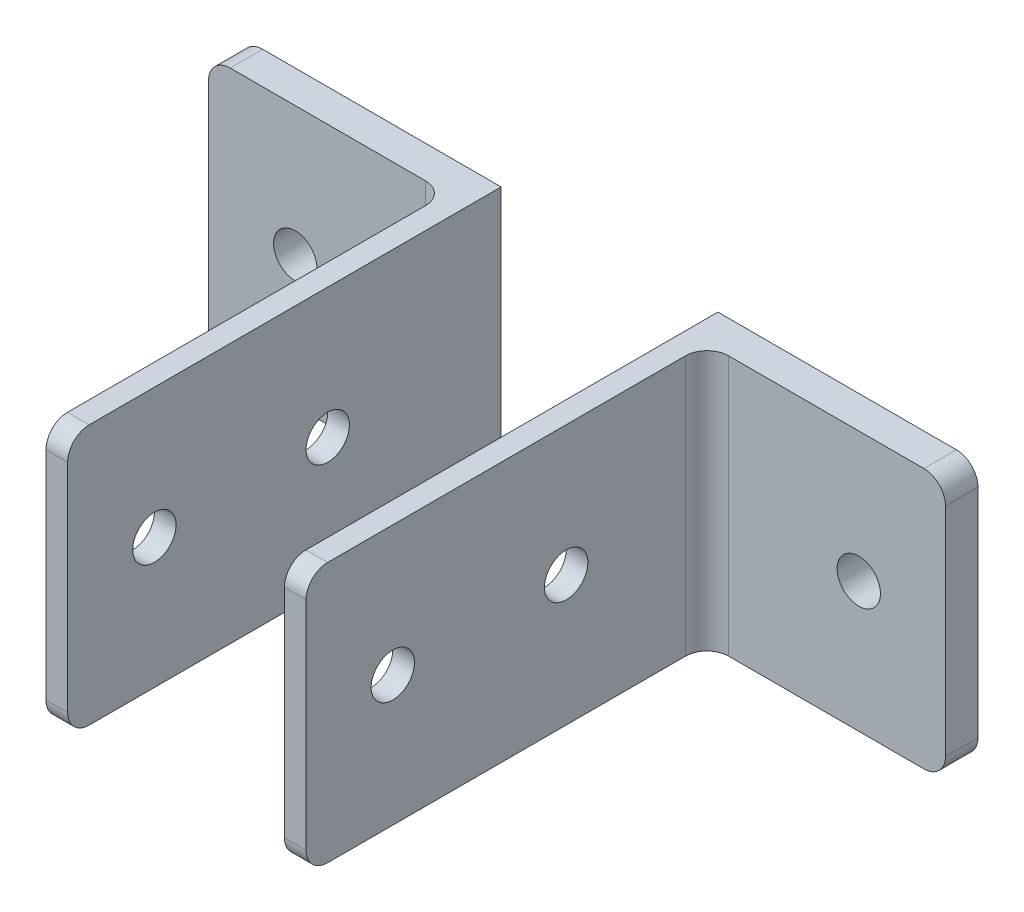
ISO-10303-21;
HEADER;
FILE_DESCRIPTION(('STEP AP214'),'2;1');
FILE_NAME('part.step','',(''),(''),'','','');
FILE_SCHEMA(('AUTOMOTIVE_DESIGN { 1 0 10303 214 1 1 1 1 }'));
ENDSEC;
DATA;
#1=APPLICATION_CONTEXT('core data for automotive mechanical design processes');
#2=APPLICATION_PROTOCOL_DEFINITION('international standard','automotive_design',2000,#1);
#3=PRODUCT_CONTEXT('',#1,'mechanical');
#4=PRODUCT('Part','Part','',(#3));
#5=PRODUCT_RELATED_PRODUCT_CATEGORY('part','',(#4));
#6=PRODUCT_DEFINITION_FORMATION('','',#4);
#7=PRODUCT_DEFINITION_CONTEXT('part definition',#1,'design');
#8=PRODUCT_DEFINITION('design','',#6,#7);
#9=PRODUCT_DEFINITION_SHAPE('','',#8);
#10=(LENGTH_UNIT() NAMED_UNIT(*) SI_UNIT(.MILLI.,.METRE.));
#11=(NAMED_UNIT(*) PLANE_ANGLE_UNIT() SI_UNIT($,.RADIAN.));
#12=(NAMED_UNIT(*) SI_UNIT($,.STERADIAN.) SOLID_ANGLE_UNIT());
#13=UNCERTAINTY_MEASURE_WITH_UNIT(LENGTH_MEASURE(1.E-05),#10,'distance_accuracy_value','');
#14=(GEOMETRIC_REPRESENTATION_CONTEXT(3) GLOBAL_UNCERTAINTY_ASSIGNED_CONTEXT((#13)) GLOBAL_UNIT_ASSIGNED_CONTEXT((#10,
#11,#12)) REPRESENTATION_CONTEXT('',''));
#15=CARTESIAN_POINT('',(0.,0.,0.));
#16=DIRECTION('',(0.,0.,1.));
#17=DIRECTION('',(1.,0.,0.));
#18=AXIS2_PLACEMENT_3D('',#15,#16,#17);
#19=CARTESIAN_POINT('',(15.875,19.05,63.5));
#20=DIRECTION('',(1.,0.,0.));
#21=DIRECTION('',(0.,0.,-1.));
#22=AXIS2_PLACEMENT_3D('',#19,#20,#21);
#23=PLANE('',#22);
#24=CARTESIAN_POINT('',(15.875,0.,25.4));
#25=DIRECTION('',(1.,0.,0.));
#26=DIRECTION('',(0.,0.,-1.));
#27=AXIS2_PLACEMENT_3D('',#24,#25,#26);
#28=CIRCLE('',#27,3.175);
#29=CARTESIAN_POINT('',(15.875,0.,22.225));
#30=VERTEX_POINT('',#29);
#31=EDGE_CURVE('E169',#30,#30,#28,.F.);
#32=ORIENTED_EDGE('',*,*,#31,.F.);
#33=EDGE_LOOP('',(#32));
#34=FACE_BOUND('',#33,.T.);
#35=DIRECTION('',(0.,0.,1.));
#36=VECTOR('',#35,1.);
#37=CARTESIAN_POINT('',(15.875,-19.05,63.5));
#38=LINE('',#37,#36);
#39=CARTESIAN_POINT('',(15.875,-19.05,0.));
#40=VERTEX_POINT('',#39);
#41=CARTESIAN_POINT('',(15.875,-19.05,60.3377));
#42=VERTEX_POINT('',#41);
#43=EDGE_CURVE('E221',#40,#42,#38,.T.);
#44=ORIENTED_EDGE('',*,*,#43,.T.);
#45=CARTESIAN_POINT('',(15.875,-15.8877,60.3377));
#46=DIRECTION('',(1.,0.,0.));
#47=DIRECTION('',(0.,0.,-1.));
#48=AXIS2_PLACEMENT_3D('',#45,#46,#47);
#49=CIRCLE('',#48,3.1623);
#50=CARTESIAN_POINT('',(15.875,-15.8877,63.5));
#51=VERTEX_POINT('',#50);
#52=EDGE_CURVE('E187',#42,#51,#49,.F.);
#53=ORIENTED_EDGE('',*,*,#52,.T.);
#54=DIRECTION('',(0.,-1.,0.));
#55=VECTOR('',#54,1.);
#56=CARTESIAN_POINT('',(15.875,19.05,63.5));
#57=LINE('',#56,#55);
#58=CARTESIAN_POINT('',(15.875,15.8877,63.5));
#59=VERTEX_POINT('',#58);
#60=EDGE_CURVE('E153',#59,#51,#57,.T.);
#61=ORIENTED_EDGE('',*,*,#60,.F.);
#62=CARTESIAN_POINT('',(15.875,15.8877,60.3377));
#63=DIRECTION('',(1.,0.,0.));
#64=DIRECTION('',(0.,0.,-1.));
#65=AXIS2_PLACEMENT_3D('',#62,#63,#64);
#66=CIRCLE('',#65,3.1623);
#67=CARTESIAN_POINT('',(15.875,19.05,60.3377));
#68=VERTEX_POINT('',#67);
#69=EDGE_CURVE('E144',#59,#68,#66,.F.);
#70=ORIENTED_EDGE('',*,*,#69,.T.);
#71=DIRECTION('',(0.,0.,1.));
#72=VECTOR('',#71,1.);
#73=CARTESIAN_POINT('',(15.875,19.05,63.5));
#74=LINE('',#73,#72);
#75=CARTESIAN_POINT('',(15.875,19.05,0.));
#76=VERTEX_POINT('',#75);
#77=EDGE_CURVE('E129',#76,#68,#74,.T.);
#78=ORIENTED_EDGE('',*,*,#77,.F.);
#79=DIRECTION('',(0.,-1.,0.));
#80=VECTOR('',#79,1.);
#81=CARTESIAN_POINT('',(15.875,19.05,0.));
#82=LINE('',#81,#80);
#83=EDGE_CURVE('E141',#76,#40,#82,.T.);
#84=ORIENTED_EDGE('',*,*,#83,.T.);
#85=EDGE_LOOP('',(#44,#53,#61,#70,#78,#84));
#86=FACE_BOUND('',#85,.T.);
#87=CARTESIAN_POINT('',(15.875,0.,50.8));
#88=DIRECTION('',(1.,0.,0.));
#89=DIRECTION('',(0.,0.,-1.));
#90=AXIS2_PLACEMENT_3D('',#87,#88,#89);
#91=CIRCLE('',#90,3.175);
#92=CARTESIAN_POINT('',(15.875,0.,47.625));
#93=VERTEX_POINT('',#92);
#94=EDGE_CURVE('E172',#93,#93,#91,.F.);
#95=ORIENTED_EDGE('',*,*,#94,.F.);
#96=EDGE_LOOP('',(#95));
#97=FACE_BOUND('',#96,.T.);
#98=ADVANCED_FACE('F41',(#34,#86,#97),#23,.F.);
#99=CARTESIAN_POINT('',(19.05,19.05,4.7625));
#100=DIRECTION('',(-1.,0.,0.));
#101=DIRECTION('',(0.,0.,1.));
#102=AXIS2_PLACEMENT_3D('',#99,#100,#101);
#103=PLANE('',#102);
#104=CARTESIAN_POINT('',(19.05,0.,25.4));
#105=DIRECTION('',(-1.,0.,0.));
#106=DIRECTION('',(0.,0.,1.));
#107=AXIS2_PLACEMENT_3D('',#104,#105,#106);
#108=CIRCLE('',#107,3.175);
#109=CARTESIAN_POINT('',(19.05,0.,28.575));
#110=VERTEX_POINT('',#109);
#111=EDGE_CURVE('E166',#110,#110,#108,.F.);
#112=ORIENTED_EDGE('',*,*,#111,.F.);
#113=EDGE_LOOP('',(#112));
#114=FACE_BOUND('',#113,.T.);
#115=DIRECTION('',(0.,-1.,0.));
#116=VECTOR('',#115,1.);
#117=CARTESIAN_POINT('',(19.05,19.05,63.5));
#118=LINE('',#117,#116);
#119=CARTESIAN_POINT('',(19.05,15.8877,63.5));
#120=VERTEX_POINT('',#119);
#121=CARTESIAN_POINT('',(19.05,-15.8877,63.5));
#122=VERTEX_POINT('',#121);
#123=EDGE_CURVE('E158',#120,#122,#118,.T.);
#124=ORIENTED_EDGE('',*,*,#123,.T.);
#125=CARTESIAN_POINT('',(19.05,-15.8877,60.3377));
#126=DIRECTION('',(-1.,0.,0.));
#127=DIRECTION('',(0.,0.,1.));
#128=AXIS2_PLACEMENT_3D('',#125,#126,#127);
#129=CIRCLE('',#128,3.1623);
#130=CARTESIAN_POINT('',(19.05,-19.05,60.3377));
#131=VERTEX_POINT('',#130);
#132=EDGE_CURVE('E180',#122,#131,#129,.F.);
#133=ORIENTED_EDGE('',*,*,#132,.T.);
#134=DIRECTION('',(0.,0.,-1.));
#135=VECTOR('',#134,1.);
#136=CARTESIAN_POINT('',(19.05,-19.05,4.7625));
#137=LINE('',#136,#135);
#138=CARTESIAN_POINT('',(19.05,-19.05,7.9248));
#139=VERTEX_POINT('',#138);
#140=EDGE_CURVE('E209',#131,#139,#137,.T.);
#141=ORIENTED_EDGE('',*,*,#140,.T.);
#142=DIRECTION('',(0.,-1.,0.));
#143=VECTOR('',#142,1.);
#144=CARTESIAN_POINT('',(19.05,19.05,7.9248));
#145=LINE('',#144,#143);
#146=CARTESIAN_POINT('',(19.05,19.05,7.9248));
#147=VERTEX_POINT('',#146);
#148=EDGE_CURVE('E176',#139,#147,#145,.F.);
#149=ORIENTED_EDGE('',*,*,#148,.T.);
#150=DIRECTION('',(0.,0.,-1.));
#151=VECTOR('',#150,1.);
#152=CARTESIAN_POINT('',(19.05,19.05,4.7625));
#153=LINE('',#152,#151);
#154=CARTESIAN_POINT('',(19.05,19.05,60.3377));
#155=VERTEX_POINT('',#154);
#156=EDGE_CURVE('E145',#155,#147,#153,.T.);
#157=ORIENTED_EDGE('',*,*,#156,.F.);
#158=CARTESIAN_POINT('',(19.05,15.8877,60.3377));
#159=DIRECTION('',(-1.,0.,0.));
#160=DIRECTION('',(0.,0.,1.));
#161=AXIS2_PLACEMENT_3D('',#158,#159,#160);
#162=CIRCLE('',#161,3.1623);
#163=EDGE_CURVE('E178',#155,#120,#162,.F.);
#164=ORIENTED_EDGE('',*,*,#163,.T.);
#165=EDGE_LOOP('',(#124,#133,#141,#149,#157,#164));
#166=FACE_BOUND('',#165,.T.);
#167=CARTESIAN_POINT('',(19.05,0.,50.8));
#168=DIRECTION('',(-1.,0.,0.));
#169=DIRECTION('',(0.,0.,1.));
#170=AXIS2_PLACEMENT_3D('',#167,#168,#169);
#171=CIRCLE('',#170,3.175);
#172=CARTESIAN_POINT('',(19.05,0.,53.975));
#173=VERTEX_POINT('',#172);
#174=EDGE_CURVE('E170',#173,#173,#171,.F.);
#175=ORIENTED_EDGE('',*,*,#174,.F.);
#176=EDGE_LOOP('',(#175));
#177=FACE_BOUND('',#176,.T.);
#178=ADVANCED_FACE('F217',(#114,#166,#177),#103,.F.);
#179=CARTESIAN_POINT('',(15.875,19.05,0.));
#180=DIRECTION('',(0.,0.,1.));
#181=DIRECTION('',(1.,0.,0.));
#182=AXIS2_PLACEMENT_3D('',#179,#180,#181);
#183=PLANE('',#182);
#184=DIRECTION('',(0.,-1.,0.));
#185=VECTOR('',#184,1.);
#186=CARTESIAN_POINT('',(53.975,19.05,0.));
#187=LINE('',#186,#185);
#188=CARTESIAN_POINT('',(53.975,15.8877,0.));
#189=VERTEX_POINT('',#188);
#190=CARTESIAN_POINT('',(53.975,-15.8877,0.));
#191=VERTEX_POINT('',#190);
#192=EDGE_CURVE('E232',#189,#191,#187,.T.);
#193=ORIENTED_EDGE('',*,*,#192,.T.);
#194=CARTESIAN_POINT('',(50.8127,-15.8877,0.));
#195=DIRECTION('',(0.,0.,1.));
#196=DIRECTION('',(1.,0.,0.));
#197=AXIS2_PLACEMENT_3D('',#194,#195,#196);
#198=CIRCLE('',#197,3.1623);
#199=CARTESIAN_POINT('',(50.8127,-19.05,0.));
#200=VERTEX_POINT('',#199);
#201=EDGE_CURVE('E56',#191,#200,#198,.F.);
#202=ORIENTED_EDGE('',*,*,#201,.T.);
#203=DIRECTION('',(-1.,0.,0.));
#204=VECTOR('',#203,1.);
#205=CARTESIAN_POINT('',(15.875,-19.05,0.));
#206=LINE('',#205,#204);
#207=EDGE_CURVE('E150',#200,#40,#206,.T.);
#208=ORIENTED_EDGE('',*,*,#207,.T.);
#209=ORIENTED_EDGE('',*,*,#83,.F.);
#210=DIRECTION('',(-1.,0.,0.));
#211=VECTOR('',#210,1.);
#212=CARTESIAN_POINT('',(15.875,19.05,0.));
#213=LINE('',#212,#211);
#214=CARTESIAN_POINT('',(50.8127,19.05,0.));
#215=VERTEX_POINT('',#214);
#216=EDGE_CURVE('E125',#215,#76,#213,.T.);
#217=ORIENTED_EDGE('',*,*,#216,.F.);
#218=CARTESIAN_POINT('',(50.8127,15.8877,0.));
#219=DIRECTION('',(0.,0.,1.));
#220=DIRECTION('',(1.,0.,0.));
#221=AXIS2_PLACEMENT_3D('',#218,#219,#220);
#222=CIRCLE('',#221,3.1623);
#223=EDGE_CURVE('E64',#215,#189,#222,.F.);
#224=ORIENTED_EDGE('',*,*,#223,.T.);
#225=EDGE_LOOP('',(#193,#202,#208,#209,#217,#224));
#226=FACE_BOUND('',#225,.T.);
#227=CARTESIAN_POINT('',(41.275,0.,0.));
#228=DIRECTION('',(0.,0.,1.));
#229=DIRECTION('',(1.,0.,0.));
#230=AXIS2_PLACEMENT_3D('',#227,#228,#229);
#231=CIRCLE('',#230,3.175);
#232=CARTESIAN_POINT('',(44.45,0.,0.));
#233=VERTEX_POINT('',#232);
#234=EDGE_CURVE('E165',#233,#233,#231,.T.);
#235=ORIENTED_EDGE('',*,*,#234,.T.);
#236=EDGE_LOOP('',(#235));
#237=FACE_BOUND('',#236,.T.);
#238=ADVANCED_FACE('F147',(#226,#237),#183,.F.);
#239=CARTESIAN_POINT('',(53.975,19.05,4.7625));
#240=DIRECTION('',(0.,0.,-1.));
#241=DIRECTION('',(-1.,0.,0.));
#242=AXIS2_PLACEMENT_3D('',#239,#240,#241);
#243=PLANE('',#242);
#244=DIRECTION('',(1.,0.,0.));
#245=VECTOR('',#244,1.);
#246=CARTESIAN_POINT('',(53.975,19.05,4.7625));
#247=LINE('',#246,#245);
#248=CARTESIAN_POINT('',(22.2123,19.05,4.7625));
#249=VERTEX_POINT('',#248);
#250=CARTESIAN_POINT('',(50.8127,19.05,4.7625));
#251=VERTEX_POINT('',#250);
#252=EDGE_CURVE('E226',#249,#251,#247,.T.);
#253=ORIENTED_EDGE('',*,*,#252,.F.);
#254=DIRECTION('',(0.,-1.,0.));
#255=VECTOR('',#254,1.);
#256=CARTESIAN_POINT('',(22.2123,-19.05,4.7625));
#257=LINE('',#256,#255);
#258=CARTESIAN_POINT('',(22.2123,-19.05,4.7625));
#259=VERTEX_POINT('',#258);
#260=EDGE_CURVE('E196',#249,#259,#257,.T.);
#261=ORIENTED_EDGE('',*,*,#260,.T.);
#262=DIRECTION('',(1.,0.,0.));
#263=VECTOR('',#262,1.);
#264=CARTESIAN_POINT('',(53.975,-19.05,4.7625));
#265=LINE('',#264,#263);
#266=CARTESIAN_POINT('',(50.8127,-19.05,4.7625));
#267=VERTEX_POINT('',#266);
#268=EDGE_CURVE('E135',#259,#267,#265,.T.);
#269=ORIENTED_EDGE('',*,*,#268,.T.);
#270=CARTESIAN_POINT('',(50.8127,-15.8877,4.7625));
#271=DIRECTION('',(0.,0.,-1.));
#272=DIRECTION('',(-1.,0.,0.));
#273=AXIS2_PLACEMENT_3D('',#270,#271,#272);
#274=CIRCLE('',#273,3.1623);
#275=CARTESIAN_POINT('',(53.975,-15.8877,4.7625));
#276=VERTEX_POINT('',#275);
#277=EDGE_CURVE('E194',#267,#276,#274,.F.);
#278=ORIENTED_EDGE('',*,*,#277,.T.);
#279=DIRECTION('',(0.,-1.,0.));
#280=VECTOR('',#279,1.);
#281=CARTESIAN_POINT('',(53.975,19.05,4.7625));
#282=LINE('',#281,#280);
#283=CARTESIAN_POINT('',(53.975,15.8877,4.7625));
#284=VERTEX_POINT('',#283);
#285=EDGE_CURVE('E234',#284,#276,#282,.T.);
#286=ORIENTED_EDGE('',*,*,#285,.F.);
#287=CARTESIAN_POINT('',(50.8127,15.8877,4.7625));
#288=DIRECTION('',(0.,0.,-1.));
#289=DIRECTION('',(-1.,0.,0.));
#290=AXIS2_PLACEMENT_3D('',#287,#288,#289);
#291=CIRCLE('',#290,3.1623);
#292=EDGE_CURVE('E192',#284,#251,#291,.F.);
#293=ORIENTED_EDGE('',*,*,#292,.T.);
#294=EDGE_LOOP('',(#253,#261,#269,#278,#286,#293));
#295=FACE_BOUND('',#294,.T.);
#296=CARTESIAN_POINT('',(41.275,0.,4.7625));
#297=DIRECTION('',(0.,0.,-1.));
#298=DIRECTION('',(-1.,0.,0.));
#299=AXIS2_PLACEMENT_3D('',#296,#297,#298);
#300=CIRCLE('',#299,3.175);
#301=CARTESIAN_POINT('',(38.1,0.,4.7625));
#302=VERTEX_POINT('',#301);
#303=EDGE_CURVE('E162',#302,#302,#300,.F.);
#304=ORIENTED_EDGE('',*,*,#303,.F.);
#305=EDGE_LOOP('',(#304));
#306=FACE_BOUND('',#305,.T.);
#307=ADVANCED_FACE('F228',(#295,#306),#243,.F.);
#308=CARTESIAN_POINT('',(19.05,19.05,63.5));
#309=DIRECTION('',(0.,0.,-1.));
#310=DIRECTION('',(-1.,0.,0.));
#311=AXIS2_PLACEMENT_3D('',#308,#309,#310);
#312=PLANE('',#311);
#313=ORIENTED_EDGE('',*,*,#60,.T.);
#314=DIRECTION('',(1.,0.,0.));
#315=VECTOR('',#314,1.);
#316=CARTESIAN_POINT('',(19.05,-15.8877,63.5));
#317=LINE('',#316,#315);
#318=EDGE_CURVE('E155',#51,#122,#317,.T.);
#319=ORIENTED_EDGE('',*,*,#318,.T.);
#320=ORIENTED_EDGE('',*,*,#123,.F.);
#321=DIRECTION('',(1.,0.,0.));
#322=VECTOR('',#321,1.);
#323=CARTESIAN_POINT('',(19.05,15.8877,63.5));
#324=LINE('',#323,#322);
#325=EDGE_CURVE('E152',#120,#59,#324,.F.);
#326=ORIENTED_EDGE('',*,*,#325,.T.);
#327=EDGE_LOOP('',(#313,#319,#320,#326));
#328=FACE_BOUND('',#327,.T.);
#329=ADVANCED_FACE('F245',(#328),#312,.F.);
#330=CARTESIAN_POINT('',(53.975,19.05,0.));
#331=DIRECTION('',(-1.,0.,0.));
#332=DIRECTION('',(0.,0.,1.));
#333=AXIS2_PLACEMENT_3D('',#330,#331,#332);
#334=PLANE('',#333);
#335=ORIENTED_EDGE('',*,*,#285,.T.);
#336=DIRECTION('',(0.,0.,-1.));
#337=VECTOR('',#336,1.);
#338=CARTESIAN_POINT('',(53.975,-15.8877,0.));
#339=LINE('',#338,#337);
#340=EDGE_CURVE('E201',#276,#191,#339,.T.);
#341=ORIENTED_EDGE('',*,*,#340,.T.);
#342=ORIENTED_EDGE('',*,*,#192,.F.);
#343=DIRECTION('',(0.,0.,-1.));
#344=VECTOR('',#343,1.);
#345=CARTESIAN_POINT('',(53.975,15.8877,0.));
#346=LINE('',#345,#344);
#347=EDGE_CURVE('E199',#189,#284,#346,.F.);
#348=ORIENTED_EDGE('',*,*,#347,.T.);
#349=EDGE_LOOP('',(#335,#341,#342,#348));
#350=FACE_BOUND('',#349,.T.);
#351=ADVANCED_FACE('F280',(#350),#334,.F.);
#352=CARTESIAN_POINT('',(53.975,19.05,0.));
#353=DIRECTION('',(0.,-1.,0.));
#354=DIRECTION('',(0.,0.,-1.));
#355=AXIS2_PLACEMENT_3D('',#352,#353,#354);
#356=PLANE('',#355);
#357=ORIENTED_EDGE('',*,*,#77,.T.);
#358=DIRECTION('',(1.,0.,0.));
#359=VECTOR('',#358,1.);
#360=CARTESIAN_POINT('',(53.975,19.05,60.3377));
#361=LINE('',#360,#359);
#362=EDGE_CURVE('E190',#68,#155,#361,.T.);
#363=ORIENTED_EDGE('',*,*,#362,.T.);
#364=ORIENTED_EDGE('',*,*,#156,.T.);
#365=CARTESIAN_POINT('',(22.2123,19.05,7.9248));
#366=DIRECTION('',(0.,-1.,0.));
#367=DIRECTION('',(0.,0.,-1.));
#368=AXIS2_PLACEMENT_3D('',#365,#366,#367);
#369=CIRCLE('',#368,3.1623);
#370=EDGE_CURVE('E12',#147,#249,#369,.T.);
#371=ORIENTED_EDGE('',*,*,#370,.T.);
#372=ORIENTED_EDGE('',*,*,#252,.T.);
#373=DIRECTION('',(0.,0.,-1.));
#374=VECTOR('',#373,1.);
#375=CARTESIAN_POINT('',(50.8127,19.05,0.));
#376=LINE('',#375,#374);
#377=EDGE_CURVE('E133',#251,#215,#376,.T.);
#378=ORIENTED_EDGE('',*,*,#377,.T.);
#379=ORIENTED_EDGE('',*,*,#216,.T.);
#380=EDGE_LOOP('',(#357,#363,#364,#371,#372,#378,#379));
#381=FACE_BOUND('',#380,.T.);
#382=ADVANCED_FACE('F127',(#381),#356,.F.);
#383=CARTESIAN_POINT('',(53.975,-19.05,0.));
#384=DIRECTION('',(0.,-1.,0.));
#385=DIRECTION('',(0.,0.,-1.));
#386=AXIS2_PLACEMENT_3D('',#383,#384,#385);
#387=PLANE('',#386);
#388=ORIENTED_EDGE('',*,*,#140,.F.);
#389=DIRECTION('',(1.,0.,0.));
#390=VECTOR('',#389,1.);
#391=CARTESIAN_POINT('',(15.875,-19.05,60.3377));
#392=LINE('',#391,#390);
#393=EDGE_CURVE('E184',#131,#42,#392,.F.);
#394=ORIENTED_EDGE('',*,*,#393,.T.);
#395=ORIENTED_EDGE('',*,*,#43,.F.);
#396=ORIENTED_EDGE('',*,*,#207,.F.);
#397=DIRECTION('',(0.,0.,-1.));
#398=VECTOR('',#397,1.);
#399=CARTESIAN_POINT('',(50.8127,-19.05,4.7625));
#400=LINE('',#399,#398);
#401=EDGE_CURVE('E182',#200,#267,#400,.F.);
#402=ORIENTED_EDGE('',*,*,#401,.T.);
#403=ORIENTED_EDGE('',*,*,#268,.F.);
#404=CARTESIAN_POINT('',(22.2123,-19.05,7.9248));
#405=DIRECTION('',(0.,-1.,0.));
#406=DIRECTION('',(0.,0.,-1.));
#407=AXIS2_PLACEMENT_3D('',#404,#405,#406);
#408=CIRCLE('',#407,3.1623);
#409=EDGE_CURVE('E49',#259,#139,#408,.F.);
#410=ORIENTED_EDGE('',*,*,#409,.T.);
#411=EDGE_LOOP('',(#388,#394,#395,#396,#402,#403,#410));
#412=FACE_BOUND('',#411,.T.);
#413=ADVANCED_FACE('F208',(#412),#387,.T.);
#414=CARTESIAN_POINT('',(41.275,0.,63.5));
#415=DIRECTION('',(0.,0.,-1.));
#416=DIRECTION('',(-1.,0.,0.));
#417=AXIS2_PLACEMENT_3D('',#414,#415,#416);
#418=CYLINDRICAL_SURFACE('',#417,3.175);
#419=ORIENTED_EDGE('',*,*,#234,.F.);
#420=EDGE_LOOP('',(#419));
#421=FACE_BOUND('',#420,.T.);
#422=ORIENTED_EDGE('',*,*,#303,.T.);
#423=EDGE_LOOP('',(#422));
#424=FACE_BOUND('',#423,.T.);
#425=ADVANCED_FACE('F287',(#421,#424),#418,.F.);
#426=CARTESIAN_POINT('',(53.975,0.,25.4));
#427=DIRECTION('',(-1.,0.,0.));
#428=DIRECTION('',(0.,0.,1.));
#429=AXIS2_PLACEMENT_3D('',#426,#427,#428);
#430=CYLINDRICAL_SURFACE('',#429,3.175);
#431=ORIENTED_EDGE('',*,*,#111,.T.);
#432=EDGE_LOOP('',(#431));
#433=FACE_BOUND('',#432,.T.);
#434=ORIENTED_EDGE('',*,*,#31,.T.);
#435=EDGE_LOOP('',(#434));
#436=FACE_BOUND('',#435,.T.);
#437=ADVANCED_FACE('F292',(#433,#436),#430,.F.);
#438=CARTESIAN_POINT('',(53.975,0.,50.8));
#439=DIRECTION('',(-1.,0.,0.));
#440=DIRECTION('',(0.,0.,1.));
#441=AXIS2_PLACEMENT_3D('',#438,#439,#440);
#442=CYLINDRICAL_SURFACE('',#441,3.175);
#443=ORIENTED_EDGE('',*,*,#174,.T.);
#444=EDGE_LOOP('',(#443));
#445=FACE_BOUND('',#444,.T.);
#446=ORIENTED_EDGE('',*,*,#94,.T.);
#447=EDGE_LOOP('',(#446));
#448=FACE_BOUND('',#447,.T.);
#449=ADVANCED_FACE('F258',(#445,#448),#442,.F.);
#450=CARTESIAN_POINT('',(19.05,-15.8877,60.3377));
#451=DIRECTION('',(-1.,0.,0.));
#452=DIRECTION('',(0.,0.,1.));
#453=AXIS2_PLACEMENT_3D('',#450,#451,#452);
#454=CYLINDRICAL_SURFACE('',#453,3.1623);
#455=ORIENTED_EDGE('',*,*,#52,.F.);
#456=ORIENTED_EDGE('',*,*,#393,.F.);
#457=ORIENTED_EDGE('',*,*,#132,.F.);
#458=ORIENTED_EDGE('',*,*,#318,.F.);
#459=EDGE_LOOP('',(#455,#456,#457,#458));
#460=FACE_BOUND('',#459,.T.);
#461=ADVANCED_FACE('F250',(#460),#454,.T.);
#462=CARTESIAN_POINT('',(53.975,15.8877,60.3377));
#463=DIRECTION('',(1.,0.,0.));
#464=DIRECTION('',(0.,0.,-1.));
#465=AXIS2_PLACEMENT_3D('',#462,#463,#464);
#466=CYLINDRICAL_SURFACE('',#465,3.1623);
#467=ORIENTED_EDGE('',*,*,#69,.F.);
#468=ORIENTED_EDGE('',*,*,#325,.F.);
#469=ORIENTED_EDGE('',*,*,#163,.F.);
#470=ORIENTED_EDGE('',*,*,#362,.F.);
#471=EDGE_LOOP('',(#467,#468,#469,#470));
#472=FACE_BOUND('',#471,.T.);
#473=ADVANCED_FACE('F248',(#472),#466,.T.);
#474=CARTESIAN_POINT('',(22.2123,19.05,7.9248));
#475=DIRECTION('',(0.,1.,0.));
#476=DIRECTION('',(0.,0.,1.));
#477=AXIS2_PLACEMENT_3D('',#474,#475,#476);
#478=CYLINDRICAL_SURFACE('',#477,3.1623);
#479=ORIENTED_EDGE('',*,*,#370,.F.);
#480=ORIENTED_EDGE('',*,*,#148,.F.);
#481=ORIENTED_EDGE('',*,*,#409,.F.);
#482=ORIENTED_EDGE('',*,*,#260,.F.);
#483=EDGE_LOOP('',(#479,#480,#481,#482));
#484=FACE_BOUND('',#483,.T.);
#485=ADVANCED_FACE('F224',(#484),#478,.F.);
#486=CARTESIAN_POINT('',(50.8127,-15.8877,0.));
#487=DIRECTION('',(0.,0.,1.));
#488=DIRECTION('',(1.,0.,0.));
#489=AXIS2_PLACEMENT_3D('',#486,#487,#488);
#490=CYLINDRICAL_SURFACE('',#489,3.1623);
#491=ORIENTED_EDGE('',*,*,#277,.F.);
#492=ORIENTED_EDGE('',*,*,#401,.F.);
#493=ORIENTED_EDGE('',*,*,#201,.F.);
#494=ORIENTED_EDGE('',*,*,#340,.F.);
#495=EDGE_LOOP('',(#491,#492,#493,#494));
#496=FACE_BOUND('',#495,.T.);
#497=ADVANCED_FACE('F256',(#496),#490,.T.);
#498=CARTESIAN_POINT('',(50.8127,15.8877,0.));
#499=DIRECTION('',(0.,0.,-1.));
#500=DIRECTION('',(-1.,0.,0.));
#501=AXIS2_PLACEMENT_3D('',#498,#499,#500);
#502=CYLINDRICAL_SURFACE('',#501,3.1623);
#503=ORIENTED_EDGE('',*,*,#292,.F.);
#504=ORIENTED_EDGE('',*,*,#347,.F.);
#505=ORIENTED_EDGE('',*,*,#223,.F.);
#506=ORIENTED_EDGE('',*,*,#377,.F.);
#507=EDGE_LOOP('',(#503,#504,#505,#506));
#508=FACE_BOUND('',#507,.T.);
#509=ADVANCED_FACE('F43',(#508),#502,.T.);
#510=CLOSED_SHELL('',(#98,#178,#238,#307,#329,#351,#382,#413,#425,#437,#449,#461,#473,#485,#497,#509));
#511=MANIFOLD_SOLID_BREP('B2',#510);
#512=CARTESIAN_POINT('',(-15.875,19.05,0.));
#513=DIRECTION('',(-1.,0.,0.));
#514=DIRECTION('',(0.,0.,1.));
#515=AXIS2_PLACEMENT_3D('',#512,#513,#514);
#516=PLANE('',#515);
#517=CARTESIAN_POINT('',(-15.875,0.,25.4));
#518=DIRECTION('',(-1.,0.,0.));
#519=DIRECTION('',(0.,0.,1.));
#520=AXIS2_PLACEMENT_3D('',#517,#518,#519);
#521=CIRCLE('',#520,3.175);
#522=CARTESIAN_POINT('',(-15.875,0.,28.575));
#523=VERTEX_POINT('',#522);
#524=EDGE_CURVE('E538',#523,#523,#521,.F.);
#525=ORIENTED_EDGE('',*,*,#524,.F.);
#526=EDGE_LOOP('',(#525));
#527=FACE_BOUND('',#526,.T.);
#528=DIRECTION('',(0.,-1.,0.));
#529=VECTOR('',#528,1.);
#530=CARTESIAN_POINT('',(-15.875,19.05,63.5));
#531=LINE('',#530,#529);
#532=CARTESIAN_POINT('',(-15.875,15.8877,63.5));
#533=VERTEX_POINT('',#532);
#534=CARTESIAN_POINT('',(-15.875,-15.8877,63.5));
#535=VERTEX_POINT('',#534);
#536=EDGE_CURVE('E601',#533,#535,#531,.T.);
#537=ORIENTED_EDGE('',*,*,#536,.T.);
#538=CARTESIAN_POINT('',(-15.875,-15.8877,60.3377));
#539=DIRECTION('',(-1.,0.,0.));
#540=DIRECTION('',(0.,0.,1.));
#541=AXIS2_PLACEMENT_3D('',#538,#539,#540);
#542=CIRCLE('',#541,3.1623);
#543=CARTESIAN_POINT('',(-15.875,-19.05,60.3377));
#544=VERTEX_POINT('',#543);
#545=EDGE_CURVE('E425',#535,#544,#542,.F.);
#546=ORIENTED_EDGE('',*,*,#545,.T.);
#547=DIRECTION('',(0.,0.,-1.));
#548=VECTOR('',#547,1.);
#549=CARTESIAN_POINT('',(-15.875,-19.05,0.));
#550=LINE('',#549,#548);
#551=CARTESIAN_POINT('',(-15.875,-19.05,0.));
#552=VERTEX_POINT('',#551);
#553=EDGE_CURVE('E519',#544,#552,#550,.T.);
#554=ORIENTED_EDGE('',*,*,#553,.T.);
#555=DIRECTION('',(0.,-1.,0.));
#556=VECTOR('',#555,1.);
#557=CARTESIAN_POINT('',(-15.875,19.05,0.));
#558=LINE('',#557,#556);
#559=CARTESIAN_POINT('',(-15.875,19.05,0.));
#560=VERTEX_POINT('',#559);
#561=EDGE_CURVE('E511',#560,#552,#558,.T.);
#562=ORIENTED_EDGE('',*,*,#561,.F.);
#563=DIRECTION('',(0.,0.,-1.));
#564=VECTOR('',#563,1.);
#565=CARTESIAN_POINT('',(-15.875,19.05,0.));
#566=LINE('',#565,#564);
#567=CARTESIAN_POINT('',(-15.875,19.05,60.3377));
#568=VERTEX_POINT('',#567);
#569=EDGE_CURVE('E494',#568,#560,#566,.T.);
#570=ORIENTED_EDGE('',*,*,#569,.F.);
#571=CARTESIAN_POINT('',(-15.875,15.8877,60.3377));
#572=DIRECTION('',(-1.,0.,0.));
#573=DIRECTION('',(0.,0.,1.));
#574=AXIS2_PLACEMENT_3D('',#571,#572,#573);
#575=CIRCLE('',#574,3.1623);
#576=EDGE_CURVE('E433',#568,#533,#575,.F.);
#577=ORIENTED_EDGE('',*,*,#576,.T.);
#578=EDGE_LOOP('',(#537,#546,#554,#562,#570,#577));
#579=FACE_BOUND('',#578,.T.);
#580=CARTESIAN_POINT('',(-15.875,0.,50.8));
#581=DIRECTION('',(-1.,0.,0.));
#582=DIRECTION('',(0.,0.,1.));
#583=AXIS2_PLACEMENT_3D('',#580,#581,#582);
#584=CIRCLE('',#583,3.175);
#585=CARTESIAN_POINT('',(-15.875,0.,53.975));
#586=VERTEX_POINT('',#585);
#587=EDGE_CURVE('E541',#586,#586,#584,.F.);
#588=ORIENTED_EDGE('',*,*,#587,.F.);
#589=EDGE_LOOP('',(#588));
#590=FACE_BOUND('',#589,.T.);
#591=ADVANCED_FACE('F410',(#527,#579,#590),#516,.F.);
#592=CARTESIAN_POINT('',(-19.05,19.05,63.5));
#593=DIRECTION('',(1.,0.,0.));
#594=DIRECTION('',(0.,0.,-1.));
#595=AXIS2_PLACEMENT_3D('',#592,#593,#594);
#596=PLANE('',#595);
#597=CARTESIAN_POINT('',(-19.05,0.,25.4));
#598=DIRECTION('',(1.,0.,0.));
#599=DIRECTION('',(0.,0.,-1.));
#600=AXIS2_PLACEMENT_3D('',#597,#598,#599);
#601=CIRCLE('',#600,3.175);
#602=CARTESIAN_POINT('',(-19.05,0.,22.225));
#603=VERTEX_POINT('',#602);
#604=EDGE_CURVE('E535',#603,#603,#601,.F.);
#605=ORIENTED_EDGE('',*,*,#604,.F.);
#606=EDGE_LOOP('',(#605));
#607=FACE_BOUND('',#606,.T.);
#608=DIRECTION('',(0.,0.,1.));
#609=VECTOR('',#608,1.);
#610=CARTESIAN_POINT('',(-19.05,19.05,63.5));
#611=LINE('',#610,#609);
#612=CARTESIAN_POINT('',(-19.05,19.05,7.92480000000002));
#613=VERTEX_POINT('',#612);
#614=CARTESIAN_POINT('',(-19.05,19.05,60.3377));
#615=VERTEX_POINT('',#614);
#616=EDGE_CURVE('E595',#613,#615,#611,.T.);
#617=ORIENTED_EDGE('',*,*,#616,.F.);
#618=DIRECTION('',(0.,-1.,0.));
#619=VECTOR('',#618,1.);
#620=CARTESIAN_POINT('',(-19.05,-19.05,7.9248));
#621=LINE('',#620,#619);
#622=CARTESIAN_POINT('',(-19.05,-19.05,7.92480000000002));
#623=VERTEX_POINT('',#622);
#624=EDGE_CURVE('E565',#613,#623,#621,.T.);
#625=ORIENTED_EDGE('',*,*,#624,.T.);
#626=DIRECTION('',(0.,0.,1.));
#627=VECTOR('',#626,1.);
#628=CARTESIAN_POINT('',(-19.05,-19.05,63.5));
#629=LINE('',#628,#627);
#630=CARTESIAN_POINT('',(-19.05,-19.05,60.3377));
#631=VERTEX_POINT('',#630);
#632=EDGE_CURVE('E504',#623,#631,#629,.T.);
#633=ORIENTED_EDGE('',*,*,#632,.T.);
#634=CARTESIAN_POINT('',(-19.05,-15.8877,60.3377));
#635=DIRECTION('',(1.,0.,0.));
#636=DIRECTION('',(0.,0.,-1.));
#637=AXIS2_PLACEMENT_3D('',#634,#635,#636);
#638=CIRCLE('',#637,3.1623);
#639=CARTESIAN_POINT('',(-19.05,-15.8877,63.5));
#640=VERTEX_POINT('',#639);
#641=EDGE_CURVE('E563',#631,#640,#638,.F.);
#642=ORIENTED_EDGE('',*,*,#641,.T.);
#643=DIRECTION('',(0.,-1.,0.));
#644=VECTOR('',#643,1.);
#645=CARTESIAN_POINT('',(-19.05,19.05,63.5));
#646=LINE('',#645,#644);
#647=CARTESIAN_POINT('',(-19.05,15.8877,63.5));
#648=VERTEX_POINT('',#647);
#649=EDGE_CURVE('E603',#648,#640,#646,.T.);
#650=ORIENTED_EDGE('',*,*,#649,.F.);
#651=CARTESIAN_POINT('',(-19.05,15.8877,60.3377));
#652=DIRECTION('',(1.,0.,0.));
#653=DIRECTION('',(0.,0.,-1.));
#654=AXIS2_PLACEMENT_3D('',#651,#652,#653);
#655=CIRCLE('',#654,3.1623);
#656=EDGE_CURVE('E561',#648,#615,#655,.F.);
#657=ORIENTED_EDGE('',*,*,#656,.T.);
#658=EDGE_LOOP('',(#617,#625,#633,#642,#650,#657));
#659=FACE_BOUND('',#658,.T.);
#660=CARTESIAN_POINT('',(-19.05,0.,50.8));
#661=DIRECTION('',(1.,0.,0.));
#662=DIRECTION('',(0.,0.,-1.));
#663=AXIS2_PLACEMENT_3D('',#660,#661,#662);
#664=CIRCLE('',#663,3.175);
#665=CARTESIAN_POINT('',(-19.05,0.,47.625));
#666=VERTEX_POINT('',#665);
#667=EDGE_CURVE('E539',#666,#666,#664,.F.);
#668=ORIENTED_EDGE('',*,*,#667,.F.);
#669=EDGE_LOOP('',(#668));
#670=FACE_BOUND('',#669,.T.);
#671=ADVANCED_FACE('F597',(#607,#659,#670),#596,.F.);
#672=CARTESIAN_POINT('',(-53.975,19.05,0.));
#673=DIRECTION('',(0.,0.,1.));
#674=DIRECTION('',(1.,0.,0.));
#675=AXIS2_PLACEMENT_3D('',#672,#673,#674);
#676=PLANE('',#675);
#677=DIRECTION('',(-1.,0.,0.));
#678=VECTOR('',#677,1.);
#679=CARTESIAN_POINT('',(-53.975,-19.05,0.));
#680=LINE('',#679,#678);
#681=CARTESIAN_POINT('',(-50.8127,-19.05,0.));
#682=VERTEX_POINT('',#681);
#683=EDGE_CURVE('E590',#552,#682,#680,.T.);
#684=ORIENTED_EDGE('',*,*,#683,.T.);
#685=CARTESIAN_POINT('',(-50.8127,-15.8877,0.));
#686=DIRECTION('',(0.,0.,1.));
#687=DIRECTION('',(1.,0.,0.));
#688=AXIS2_PLACEMENT_3D('',#685,#686,#687);
#689=CIRCLE('',#688,3.1623);
#690=CARTESIAN_POINT('',(-53.975,-15.8877,0.));
#691=VERTEX_POINT('',#690);
#692=EDGE_CURVE('E556',#682,#691,#689,.F.);
#693=ORIENTED_EDGE('',*,*,#692,.T.);
#694=DIRECTION('',(0.,-1.,0.));
#695=VECTOR('',#694,1.);
#696=CARTESIAN_POINT('',(-53.975,19.05,0.));
#697=LINE('',#696,#695);
#698=CARTESIAN_POINT('',(-53.975,15.8877,0.));
#699=VERTEX_POINT('',#698);
#700=EDGE_CURVE('E522',#699,#691,#697,.T.);
#701=ORIENTED_EDGE('',*,*,#700,.F.);
#702=CARTESIAN_POINT('',(-50.8127,15.8877,0.));
#703=DIRECTION('',(0.,0.,1.));
#704=DIRECTION('',(1.,0.,0.));
#705=AXIS2_PLACEMENT_3D('',#702,#703,#704);
#706=CIRCLE('',#705,3.1623);
#707=CARTESIAN_POINT('',(-50.8127,19.05,0.));
#708=VERTEX_POINT('',#707);
#709=EDGE_CURVE('E514',#699,#708,#706,.F.);
#710=ORIENTED_EDGE('',*,*,#709,.T.);
#711=DIRECTION('',(-1.,0.,0.));
#712=VECTOR('',#711,1.);
#713=CARTESIAN_POINT('',(-53.975,19.05,0.));
#714=LINE('',#713,#712);
#715=EDGE_CURVE('E498',#560,#708,#714,.T.);
#716=ORIENTED_EDGE('',*,*,#715,.F.);
#717=ORIENTED_EDGE('',*,*,#561,.T.);
#718=EDGE_LOOP('',(#684,#693,#701,#710,#716,#717));
#719=FACE_BOUND('',#718,.T.);
#720=CARTESIAN_POINT('',(-41.275,0.,0.));
#721=DIRECTION('',(0.,0.,1.));
#722=DIRECTION('',(1.,0.,0.));
#723=AXIS2_PLACEMENT_3D('',#720,#721,#722);
#724=CIRCLE('',#723,3.175);
#725=CARTESIAN_POINT('',(-38.1,0.,0.));
#726=VERTEX_POINT('',#725);
#727=EDGE_CURVE('E534',#726,#726,#724,.T.);
#728=ORIENTED_EDGE('',*,*,#727,.T.);
#729=EDGE_LOOP('',(#728));
#730=FACE_BOUND('',#729,.T.);
#731=ADVANCED_FACE('F509',(#719,#730),#676,.F.);
#732=CARTESIAN_POINT('',(-19.05,19.05,4.7625));
#733=DIRECTION('',(0.,0.,-1.));
#734=DIRECTION('',(-1.,0.,0.));
#735=AXIS2_PLACEMENT_3D('',#732,#733,#734);
#736=PLANE('',#735);
#737=DIRECTION('',(0.,-1.,0.));
#738=VECTOR('',#737,1.);
#739=CARTESIAN_POINT('',(-53.975,19.05,4.7625));
#740=LINE('',#739,#738);
#741=CARTESIAN_POINT('',(-53.975,15.8877,4.7625));
#742=VERTEX_POINT('',#741);
#743=CARTESIAN_POINT('',(-53.975,-15.8877,4.7625));
#744=VERTEX_POINT('',#743);
#745=EDGE_CURVE('E527',#742,#744,#740,.T.);
#746=ORIENTED_EDGE('',*,*,#745,.T.);
#747=CARTESIAN_POINT('',(-50.8127,-15.8877,4.7625));
#748=DIRECTION('',(0.,0.,-1.));
#749=DIRECTION('',(-1.,0.,0.));
#750=AXIS2_PLACEMENT_3D('',#747,#748,#749);
#751=CIRCLE('',#750,3.1623);
#752=CARTESIAN_POINT('',(-50.8127,-19.05,4.7625));
#753=VERTEX_POINT('',#752);
#754=EDGE_CURVE('E549',#744,#753,#751,.F.);
#755=ORIENTED_EDGE('',*,*,#754,.T.);
#756=DIRECTION('',(1.,0.,0.));
#757=VECTOR('',#756,1.);
#758=CARTESIAN_POINT('',(-19.05,-19.05,4.7625));
#759=LINE('',#758,#757);
#760=CARTESIAN_POINT('',(-22.2123,-19.05,4.7625));
#761=VERTEX_POINT('',#760);
#762=EDGE_CURVE('E578',#753,#761,#759,.T.);
#763=ORIENTED_EDGE('',*,*,#762,.T.);
#764=DIRECTION('',(0.,-1.,0.));
#765=VECTOR('',#764,1.);
#766=CARTESIAN_POINT('',(-22.2123,19.05,4.7625));
#767=LINE('',#766,#765);
#768=CARTESIAN_POINT('',(-22.2123,19.05,4.7625));
#769=VERTEX_POINT('',#768);
#770=EDGE_CURVE('E545',#761,#769,#767,.F.);
#771=ORIENTED_EDGE('',*,*,#770,.T.);
#772=DIRECTION('',(1.,0.,0.));
#773=VECTOR('',#772,1.);
#774=CARTESIAN_POINT('',(-19.05,19.05,4.7625));
#775=LINE('',#774,#773);
#776=CARTESIAN_POINT('',(-50.8127,19.05,4.7625));
#777=VERTEX_POINT('',#776);
#778=EDGE_CURVE('E515',#777,#769,#775,.T.);
#779=ORIENTED_EDGE('',*,*,#778,.F.);
#780=CARTESIAN_POINT('',(-50.8127,15.8877,4.7625));
#781=DIRECTION('',(0.,0.,-1.));
#782=DIRECTION('',(-1.,0.,0.));
#783=AXIS2_PLACEMENT_3D('',#780,#781,#782);
#784=CIRCLE('',#783,3.1623);
#785=EDGE_CURVE('E547',#777,#742,#784,.F.);
#786=ORIENTED_EDGE('',*,*,#785,.T.);
#787=EDGE_LOOP('',(#746,#755,#763,#771,#779,#786));
#788=FACE_BOUND('',#787,.T.);
#789=CARTESIAN_POINT('',(-41.275,0.,4.7625));
#790=DIRECTION('',(0.,0.,-1.));
#791=DIRECTION('',(-1.,0.,0.));
#792=AXIS2_PLACEMENT_3D('',#789,#790,#791);
#793=CIRCLE('',#792,3.175);
#794=CARTESIAN_POINT('',(-44.45,0.,4.7625));
#795=VERTEX_POINT('',#794);
#796=EDGE_CURVE('E531',#795,#795,#793,.F.);
#797=ORIENTED_EDGE('',*,*,#796,.F.);
#798=EDGE_LOOP('',(#797));
#799=FACE_BOUND('',#798,.T.);
#800=ADVANCED_FACE('F586',(#788,#799),#736,.F.);
#801=CARTESIAN_POINT('',(-53.975,19.05,4.7625));
#802=DIRECTION('',(1.,0.,0.));
#803=DIRECTION('',(0.,0.,-1.));
#804=AXIS2_PLACEMENT_3D('',#801,#802,#803);
#805=PLANE('',#804);
#806=ORIENTED_EDGE('',*,*,#700,.T.);
#807=DIRECTION('',(0.,0.,1.));
#808=VECTOR('',#807,1.);
#809=CARTESIAN_POINT('',(-53.975,-15.8877,4.7625));
#810=LINE('',#809,#808);
#811=EDGE_CURVE('E524',#691,#744,#810,.T.);
#812=ORIENTED_EDGE('',*,*,#811,.T.);
#813=ORIENTED_EDGE('',*,*,#745,.F.);
#814=DIRECTION('',(0.,0.,1.));
#815=VECTOR('',#814,1.);
#816=CARTESIAN_POINT('',(-53.975,15.8877,4.7625));
#817=LINE('',#816,#815);
#818=EDGE_CURVE('E521',#742,#699,#817,.F.);
#819=ORIENTED_EDGE('',*,*,#818,.T.);
#820=EDGE_LOOP('',(#806,#812,#813,#819));
#821=FACE_BOUND('',#820,.T.);
#822=ADVANCED_FACE('F614',(#821),#805,.F.);
#823=CARTESIAN_POINT('',(-15.875,19.05,63.5));
#824=DIRECTION('',(0.,0.,-1.));
#825=DIRECTION('',(-1.,0.,0.));
#826=AXIS2_PLACEMENT_3D('',#823,#824,#825);
#827=PLANE('',#826);
#828=ORIENTED_EDGE('',*,*,#649,.T.);
#829=DIRECTION('',(1.,0.,0.));
#830=VECTOR('',#829,1.);
#831=CARTESIAN_POINT('',(-15.875,-15.8877,63.5));
#832=LINE('',#831,#830);
#833=EDGE_CURVE('E570',#640,#535,#832,.T.);
#834=ORIENTED_EDGE('',*,*,#833,.T.);
#835=ORIENTED_EDGE('',*,*,#536,.F.);
#836=DIRECTION('',(1.,0.,0.));
#837=VECTOR('',#836,1.);
#838=CARTESIAN_POINT('',(-15.875,15.8877,63.5));
#839=LINE('',#838,#837);
#840=EDGE_CURVE('E568',#533,#648,#839,.F.);
#841=ORIENTED_EDGE('',*,*,#840,.T.);
#842=EDGE_LOOP('',(#828,#834,#835,#841));
#843=FACE_BOUND('',#842,.T.);
#844=ADVANCED_FACE('F644',(#843),#827,.F.);
#845=CARTESIAN_POINT('',(-15.875,19.05,63.5));
#846=DIRECTION('',(0.,-1.,0.));
#847=DIRECTION('',(0.,0.,-1.));
#848=AXIS2_PLACEMENT_3D('',#845,#846,#847);
#849=PLANE('',#848);
#850=ORIENTED_EDGE('',*,*,#715,.T.);
#851=DIRECTION('',(0.,0.,1.));
#852=VECTOR('',#851,1.);
#853=CARTESIAN_POINT('',(-50.8127,19.05,63.5));
#854=LINE('',#853,#852);
#855=EDGE_CURVE('E559',#708,#777,#854,.T.);
#856=ORIENTED_EDGE('',*,*,#855,.T.);
#857=ORIENTED_EDGE('',*,*,#778,.T.);
#858=CARTESIAN_POINT('',(-22.2123,19.05,7.9248));
#859=DIRECTION('',(0.,-1.,0.));
#860=DIRECTION('',(0.,0.,-1.));
#861=AXIS2_PLACEMENT_3D('',#858,#859,#860);
#862=CIRCLE('',#861,3.1623);
#863=EDGE_CURVE('E39',#769,#613,#862,.T.);
#864=ORIENTED_EDGE('',*,*,#863,.T.);
#865=ORIENTED_EDGE('',*,*,#616,.T.);
#866=DIRECTION('',(1.,0.,0.));
#867=VECTOR('',#866,1.);
#868=CARTESIAN_POINT('',(-15.875,19.05,60.3377));
#869=LINE('',#868,#867);
#870=EDGE_CURVE('E502',#615,#568,#869,.T.);
#871=ORIENTED_EDGE('',*,*,#870,.T.);
#872=ORIENTED_EDGE('',*,*,#569,.T.);
#873=EDGE_LOOP('',(#850,#856,#857,#864,#865,#871,#872));
#874=FACE_BOUND('',#873,.T.);
#875=ADVANCED_FACE('F496',(#874),#849,.F.);
#876=CARTESIAN_POINT('',(-15.875,-19.05,63.5));
#877=DIRECTION('',(0.,-1.,0.));
#878=DIRECTION('',(0.,0.,-1.));
#879=AXIS2_PLACEMENT_3D('',#876,#877,#878);
#880=PLANE('',#879);
#881=ORIENTED_EDGE('',*,*,#762,.F.);
#882=DIRECTION('',(0.,0.,1.));
#883=VECTOR('',#882,1.);
#884=CARTESIAN_POINT('',(-50.8127,-19.05,0.));
#885=LINE('',#884,#883);
#886=EDGE_CURVE('E553',#753,#682,#885,.F.);
#887=ORIENTED_EDGE('',*,*,#886,.T.);
#888=ORIENTED_EDGE('',*,*,#683,.F.);
#889=ORIENTED_EDGE('',*,*,#553,.F.);
#890=DIRECTION('',(1.,0.,0.));
#891=VECTOR('',#890,1.);
#892=CARTESIAN_POINT('',(-19.05,-19.05,60.3377));
#893=LINE('',#892,#891);
#894=EDGE_CURVE('E551',#544,#631,#893,.F.);
#895=ORIENTED_EDGE('',*,*,#894,.T.);
#896=ORIENTED_EDGE('',*,*,#632,.F.);
#897=CARTESIAN_POINT('',(-22.2123,-19.05,7.9248));
#898=DIRECTION('',(0.,-1.,0.));
#899=DIRECTION('',(0.,0.,-1.));
#900=AXIS2_PLACEMENT_3D('',#897,#898,#899);
#901=CIRCLE('',#900,3.1623);
#902=EDGE_CURVE('E418',#623,#761,#901,.F.);
#903=ORIENTED_EDGE('',*,*,#902,.T.);
#904=EDGE_LOOP('',(#881,#887,#888,#889,#895,#896,#903));
#905=FACE_BOUND('',#904,.T.);
#906=ADVANCED_FACE('F577',(#905),#880,.T.);
#907=CARTESIAN_POINT('',(-41.275,0.,63.5));
#908=DIRECTION('',(0.,0.,-1.));
#909=DIRECTION('',(-1.,0.,0.));
#910=AXIS2_PLACEMENT_3D('',#907,#908,#909);
#911=CYLINDRICAL_SURFACE('',#910,3.175);
#912=ORIENTED_EDGE('',*,*,#727,.F.);
#913=EDGE_LOOP('',(#912));
#914=FACE_BOUND('',#913,.T.);
#915=ORIENTED_EDGE('',*,*,#796,.T.);
#916=EDGE_LOOP('',(#915));
#917=FACE_BOUND('',#916,.T.);
#918=ADVANCED_FACE('F652',(#914,#917),#911,.F.);
#919=CARTESIAN_POINT('',(53.975,0.,25.4));
#920=DIRECTION('',(-1.,0.,0.));
#921=DIRECTION('',(0.,0.,1.));
#922=AXIS2_PLACEMENT_3D('',#919,#920,#921);
#923=CYLINDRICAL_SURFACE('',#922,3.175);
#924=ORIENTED_EDGE('',*,*,#604,.T.);
#925=EDGE_LOOP('',(#924));
#926=FACE_BOUND('',#925,.T.);
#927=ORIENTED_EDGE('',*,*,#524,.T.);
#928=EDGE_LOOP('',(#927));
#929=FACE_BOUND('',#928,.T.);
#930=ADVANCED_FACE('F657',(#926,#929),#923,.F.);
#931=CARTESIAN_POINT('',(53.975,0.,50.8));
#932=DIRECTION('',(-1.,0.,0.));
#933=DIRECTION('',(0.,0.,1.));
#934=AXIS2_PLACEMENT_3D('',#931,#932,#933);
#935=CYLINDRICAL_SURFACE('',#934,3.175);
#936=ORIENTED_EDGE('',*,*,#667,.T.);
#937=EDGE_LOOP('',(#936));
#938=FACE_BOUND('',#937,.T.);
#939=ORIENTED_EDGE('',*,*,#587,.T.);
#940=EDGE_LOOP('',(#939));
#941=FACE_BOUND('',#940,.T.);
#942=ADVANCED_FACE('F627',(#938,#941),#935,.F.);
#943=CARTESIAN_POINT('',(-50.8127,-15.8877,4.7625));
#944=DIRECTION('',(0.,0.,-1.));
#945=DIRECTION('',(-1.,0.,0.));
#946=AXIS2_PLACEMENT_3D('',#943,#944,#945);
#947=CYLINDRICAL_SURFACE('',#946,3.1623);
#948=ORIENTED_EDGE('',*,*,#692,.F.);
#949=ORIENTED_EDGE('',*,*,#886,.F.);
#950=ORIENTED_EDGE('',*,*,#754,.F.);
#951=ORIENTED_EDGE('',*,*,#811,.F.);
#952=EDGE_LOOP('',(#948,#949,#950,#951));
#953=FACE_BOUND('',#952,.T.);
#954=ADVANCED_FACE('F619',(#953),#947,.T.);
#955=CARTESIAN_POINT('',(-50.8127,15.8877,63.5));
#956=DIRECTION('',(0.,0.,1.));
#957=DIRECTION('',(1.,0.,0.));
#958=AXIS2_PLACEMENT_3D('',#955,#956,#957);
#959=CYLINDRICAL_SURFACE('',#958,3.1623);
#960=ORIENTED_EDGE('',*,*,#709,.F.);
#961=ORIENTED_EDGE('',*,*,#818,.F.);
#962=ORIENTED_EDGE('',*,*,#785,.F.);
#963=ORIENTED_EDGE('',*,*,#855,.F.);
#964=EDGE_LOOP('',(#960,#961,#962,#963));
#965=FACE_BOUND('',#964,.T.);
#966=ADVANCED_FACE('F617',(#965),#959,.T.);
#967=CARTESIAN_POINT('',(-22.2123,19.05,7.9248));
#968=DIRECTION('',(0.,1.,0.));
#969=DIRECTION('',(0.,0.,1.));
#970=AXIS2_PLACEMENT_3D('',#967,#968,#969);
#971=CYLINDRICAL_SURFACE('',#970,3.1623);
#972=ORIENTED_EDGE('',*,*,#863,.F.);
#973=ORIENTED_EDGE('',*,*,#770,.F.);
#974=ORIENTED_EDGE('',*,*,#902,.F.);
#975=ORIENTED_EDGE('',*,*,#624,.F.);
#976=EDGE_LOOP('',(#972,#973,#974,#975));
#977=FACE_BOUND('',#976,.T.);
#978=ADVANCED_FACE('F593',(#977),#971,.F.);
#979=CARTESIAN_POINT('',(-15.875,-15.8877,60.3377));
#980=DIRECTION('',(-1.,0.,0.));
#981=DIRECTION('',(0.,0.,1.));
#982=AXIS2_PLACEMENT_3D('',#979,#980,#981);
#983=CYLINDRICAL_SURFACE('',#982,3.1623);
#984=ORIENTED_EDGE('',*,*,#641,.F.);
#985=ORIENTED_EDGE('',*,*,#894,.F.);
#986=ORIENTED_EDGE('',*,*,#545,.F.);
#987=ORIENTED_EDGE('',*,*,#833,.F.);
#988=EDGE_LOOP('',(#984,#985,#986,#987));
#989=FACE_BOUND('',#988,.T.);
#990=ADVANCED_FACE('F625',(#989),#983,.T.);
#991=CARTESIAN_POINT('',(-15.875,15.8877,60.3377));
#992=DIRECTION('',(1.,0.,0.));
#993=DIRECTION('',(0.,0.,-1.));
#994=AXIS2_PLACEMENT_3D('',#991,#992,#993);
#995=CYLINDRICAL_SURFACE('',#994,3.1623);
#996=ORIENTED_EDGE('',*,*,#656,.F.);
#997=ORIENTED_EDGE('',*,*,#840,.F.);
#998=ORIENTED_EDGE('',*,*,#576,.F.);
#999=ORIENTED_EDGE('',*,*,#870,.F.);
#1000=EDGE_LOOP('',(#996,#997,#998,#999));
#1001=FACE_BOUND('',#1000,.T.);
#1002=ADVANCED_FACE('F412',(#1001),#995,.T.);
#1003=CLOSED_SHELL('',(#591,#671,#731,#800,#822,#844,#875,#906,#918,#930,#942,#954,#966,#978,
#990,#1002));
#1004=MANIFOLD_SOLID_BREP('B6',#1003);
#1005=ADVANCED_BREP_SHAPE_REPRESENTATION('',(#18,#511,#1004),#14);
#1006=SHAPE_DEFINITION_REPRESENTATION(#9,#1005);
ENDSEC;
END-ISO-10303-21;
